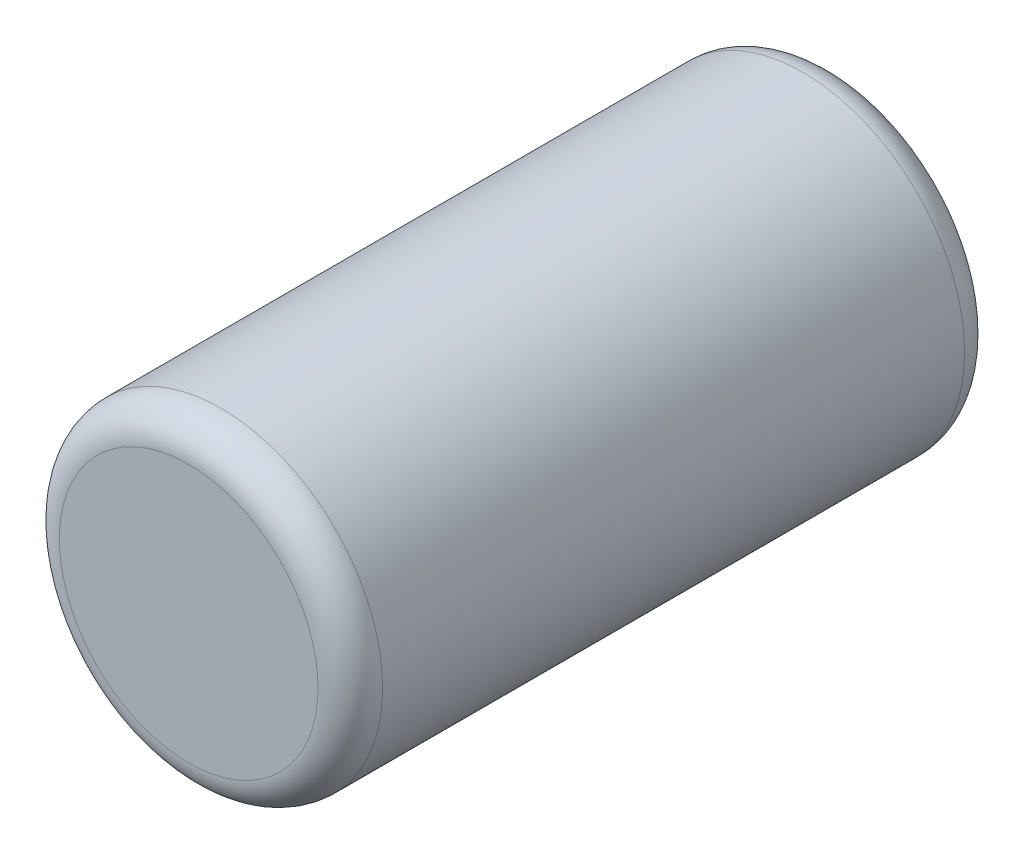
ISO-10303-21;
HEADER;
FILE_DESCRIPTION(('STEP AP214'),'2;1');
FILE_NAME('part.step','',(''),(''),'','','');
FILE_SCHEMA(('AUTOMOTIVE_DESIGN { 1 0 10303 214 1 1 1 1 }'));
ENDSEC;
DATA;
#1=APPLICATION_CONTEXT('core data for automotive mechanical design processes');
#2=APPLICATION_PROTOCOL_DEFINITION('international standard','automotive_design',2000,#1);
#3=PRODUCT_CONTEXT('',#1,'mechanical');
#4=PRODUCT('Part','Part','',(#3));
#5=PRODUCT_RELATED_PRODUCT_CATEGORY('part','',(#4));
#6=PRODUCT_DEFINITION_FORMATION('','',#4);
#7=PRODUCT_DEFINITION_CONTEXT('part definition',#1,'design');
#8=PRODUCT_DEFINITION('design','',#6,#7);
#9=PRODUCT_DEFINITION_SHAPE('','',#8);
#10=(LENGTH_UNIT() NAMED_UNIT(*) SI_UNIT(.MILLI.,.METRE.));
#11=(NAMED_UNIT(*) PLANE_ANGLE_UNIT() SI_UNIT($,.RADIAN.));
#12=(NAMED_UNIT(*) SI_UNIT($,.STERADIAN.) SOLID_ANGLE_UNIT());
#13=UNCERTAINTY_MEASURE_WITH_UNIT(LENGTH_MEASURE(1.E-05),#10,'distance_accuracy_value','');
#14=(GEOMETRIC_REPRESENTATION_CONTEXT(3) GLOBAL_UNCERTAINTY_ASSIGNED_CONTEXT((#13)) GLOBAL_UNIT_ASSIGNED_CONTEXT((#10,
#11,#12)) REPRESENTATION_CONTEXT('',''));
#15=CARTESIAN_POINT('',(0.,0.,0.));
#16=DIRECTION('',(0.,0.,1.));
#17=DIRECTION('',(1.,0.,0.));
#18=AXIS2_PLACEMENT_3D('',#15,#16,#17);
#19=CARTESIAN_POINT('',(0.,0.,10.));
#20=DIRECTION('',(0.,0.,-1.));
#21=DIRECTION('',(-1.,0.,0.));
#22=AXIS2_PLACEMENT_3D('',#19,#20,#21);
#23=CYLINDRICAL_SURFACE('',#22,2.5);
#24=CARTESIAN_POINT('',(0.,0.,0.5));
#25=DIRECTION('',(0.,0.,1.));
#26=DIRECTION('',(1.,0.,0.));
#27=AXIS2_PLACEMENT_3D('',#24,#25,#26);
#28=CIRCLE('',#27,2.5);
#29=CARTESIAN_POINT('',(2.5,0.,0.5));
#30=VERTEX_POINT('',#29);
#31=EDGE_CURVE('E41',#30,#30,#28,.T.);
#32=ORIENTED_EDGE('',*,*,#31,.T.);
#33=EDGE_LOOP('',(#32));
#34=FACE_BOUND('',#33,.T.);
#35=CARTESIAN_POINT('',(0.,0.,9.5));
#36=DIRECTION('',(0.,0.,1.));
#37=DIRECTION('',(1.,0.,0.));
#38=AXIS2_PLACEMENT_3D('',#35,#36,#37);
#39=CIRCLE('',#38,2.5);
#40=CARTESIAN_POINT('',(2.5,0.,9.5));
#41=VERTEX_POINT('',#40);
#42=EDGE_CURVE('E45',#41,#41,#39,.F.);
#43=ORIENTED_EDGE('',*,*,#42,.T.);
#44=EDGE_LOOP('',(#43));
#45=FACE_BOUND('',#44,.T.);
#46=ADVANCED_FACE('F30',(#34,#45),#23,.T.);
#47=CARTESIAN_POINT('',(0.,0.,10.));
#48=DIRECTION('',(0.,0.,1.));
#49=DIRECTION('',(1.,0.,0.));
#50=AXIS2_PLACEMENT_3D('',#47,#48,#49);
#51=PLANE('',#50);
#52=CARTESIAN_POINT('',(0.,0.,10.));
#53=DIRECTION('',(0.,0.,1.));
#54=DIRECTION('',(1.,0.,0.));
#55=AXIS2_PLACEMENT_3D('',#52,#53,#54);
#56=CIRCLE('',#55,2.);
#57=CARTESIAN_POINT('',(2.,0.,10.));
#58=VERTEX_POINT('',#57);
#59=EDGE_CURVE('E10',#58,#58,#56,.T.);
#60=ORIENTED_EDGE('',*,*,#59,.T.);
#61=EDGE_LOOP('',(#60));
#62=FACE_BOUND('',#61,.T.);
#63=ADVANCED_FACE('F61',(#62),#51,.T.);
#64=CARTESIAN_POINT('',(0.,0.,0.));
#65=DIRECTION('',(0.,0.,1.));
#66=DIRECTION('',(1.,0.,0.));
#67=AXIS2_PLACEMENT_3D('',#64,#65,#66);
#68=PLANE('',#67);
#69=CARTESIAN_POINT('',(0.,0.,0.));
#70=DIRECTION('',(0.,0.,1.));
#71=DIRECTION('',(1.,0.,0.));
#72=AXIS2_PLACEMENT_3D('',#69,#70,#71);
#73=CIRCLE('',#72,2.);
#74=CARTESIAN_POINT('',(2.,0.,0.));
#75=VERTEX_POINT('',#74);
#76=EDGE_CURVE('E37',#75,#75,#73,.F.);
#77=ORIENTED_EDGE('',*,*,#76,.T.);
#78=EDGE_LOOP('',(#77));
#79=FACE_BOUND('',#78,.T.);
#80=ADVANCED_FACE('F58',(#79),#68,.F.);
#81=CARTESIAN_POINT('',(0.,0.,0.5));
#82=DIRECTION('',(0.,0.,1.));
#83=DIRECTION('',(1.,0.,0.));
#84=AXIS2_PLACEMENT_3D('',#81,#82,#83);
#85=TOROIDAL_SURFACE('',#84,2.,0.5);
#86=ORIENTED_EDGE('',*,*,#76,.F.);
#87=EDGE_LOOP('',(#86));
#88=FACE_BOUND('',#87,.T.);
#89=ORIENTED_EDGE('',*,*,#31,.F.);
#90=EDGE_LOOP('',(#89));
#91=FACE_BOUND('',#90,.T.);
#92=ADVANCED_FACE('F54',(#88,#91),#85,.T.);
#93=CARTESIAN_POINT('',(0.,0.,9.5));
#94=DIRECTION('',(0.,0.,1.));
#95=DIRECTION('',(1.,0.,0.));
#96=AXIS2_PLACEMENT_3D('',#93,#94,#95);
#97=TOROIDAL_SURFACE('',#96,2.,0.5);
#98=ORIENTED_EDGE('',*,*,#42,.F.);
#99=EDGE_LOOP('',(#98));
#100=FACE_BOUND('',#99,.T.);
#101=ORIENTED_EDGE('',*,*,#59,.F.);
#102=EDGE_LOOP('',(#101));
#103=FACE_BOUND('',#102,.T.);
#104=ADVANCED_FACE('F32',(#100,#103),#97,.T.);
#105=CLOSED_SHELL('',(#46,#63,#80,#92,#104));
#106=MANIFOLD_SOLID_BREP('B2',#105);
#107=ADVANCED_BREP_SHAPE_REPRESENTATION('',(#18,#106),#14);
#108=SHAPE_DEFINITION_REPRESENTATION(#9,#107);
ENDSEC;
END-ISO-10303-21;
